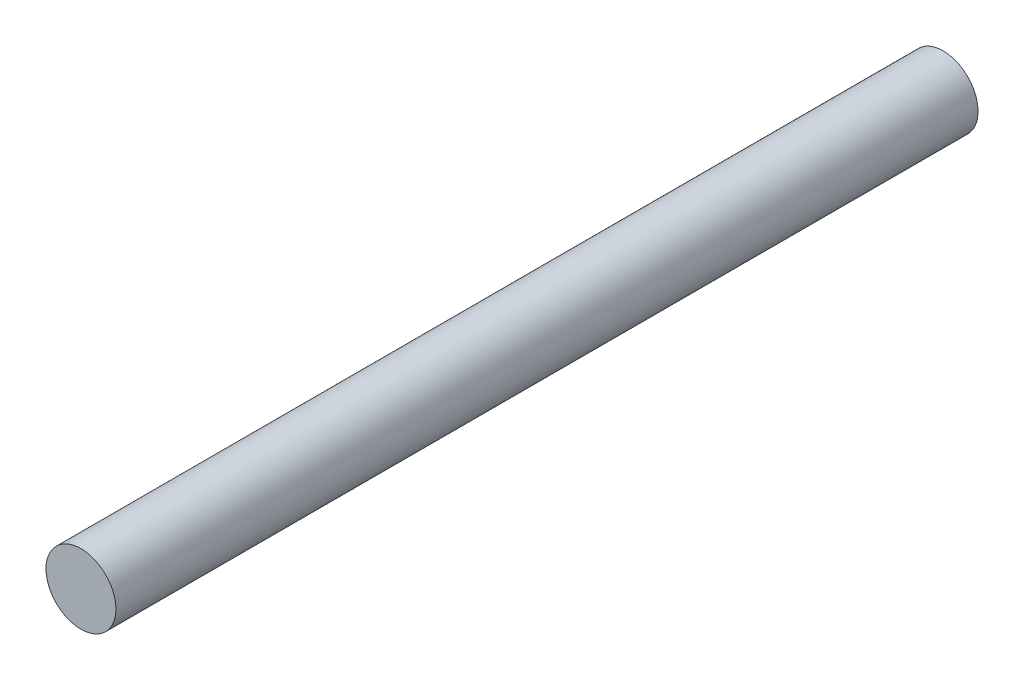
ISO-10303-21;
HEADER;
FILE_DESCRIPTION(('STEP AP214'),'2;1');
FILE_NAME('part.step','',(''),(''),'','','');
FILE_SCHEMA(('AUTOMOTIVE_DESIGN { 1 0 10303 214 1 1 1 1 }'));
ENDSEC;
DATA;
#1=APPLICATION_CONTEXT('core data for automotive mechanical design processes');
#2=APPLICATION_PROTOCOL_DEFINITION('international standard','automotive_design',2000,#1);
#3=PRODUCT_CONTEXT('',#1,'mechanical');
#4=PRODUCT('Part','Part','',(#3));
#5=PRODUCT_RELATED_PRODUCT_CATEGORY('part','',(#4));
#6=PRODUCT_DEFINITION_FORMATION('','',#4);
#7=PRODUCT_DEFINITION_CONTEXT('part definition',#1,'design');
#8=PRODUCT_DEFINITION('design','',#6,#7);
#9=PRODUCT_DEFINITION_SHAPE('','',#8);
#10=(LENGTH_UNIT() NAMED_UNIT(*) SI_UNIT(.MILLI.,.METRE.));
#11=(NAMED_UNIT(*) PLANE_ANGLE_UNIT() SI_UNIT($,.RADIAN.));
#12=(NAMED_UNIT(*) SI_UNIT($,.STERADIAN.) SOLID_ANGLE_UNIT());
#13=UNCERTAINTY_MEASURE_WITH_UNIT(LENGTH_MEASURE(1.E-05),#10,'distance_accuracy_value','');
#14=(GEOMETRIC_REPRESENTATION_CONTEXT(3) GLOBAL_UNCERTAINTY_ASSIGNED_CONTEXT((#13)) GLOBAL_UNIT_ASSIGNED_CONTEXT((#10,
#11,#12)) REPRESENTATION_CONTEXT('',''));
#15=CARTESIAN_POINT('',(0.,0.,0.));
#16=DIRECTION('',(0.,0.,1.));
#17=DIRECTION('',(1.,0.,0.));
#18=AXIS2_PLACEMENT_3D('',#15,#16,#17);
#19=CARTESIAN_POINT('',(0.,0.,1219.2));
#20=DIRECTION('',(0.,0.,-1.));
#21=DIRECTION('',(-1.,0.,0.));
#22=AXIS2_PLACEMENT_3D('',#19,#20,#21);
#23=CYLINDRICAL_SURFACE('',#22,49.403);
#24=CARTESIAN_POINT('',(0.,0.,1219.2));
#25=DIRECTION('',(0.,0.,1.));
#26=DIRECTION('',(1.,0.,0.));
#27=AXIS2_PLACEMENT_3D('',#24,#25,#26);
#28=CIRCLE('',#27,49.403);
#29=CARTESIAN_POINT('',(-49.403,0.,1219.2));
#30=VERTEX_POINT('',#29);
#31=EDGE_CURVE('E10',#30,#30,#28,.T.);
#32=CARTESIAN_POINT('',(0.,0.,0.));
#33=DIRECTION('',(0.,0.,1.));
#34=DIRECTION('',(1.,0.,0.));
#35=AXIS2_PLACEMENT_3D('',#32,#33,#34);
#36=CIRCLE('',#35,49.403);
#37=CARTESIAN_POINT('',(-49.403,0.,0.));
#38=VERTEX_POINT('',#37);
#39=EDGE_CURVE('E34',#38,#38,#36,.T.);
#40=CARTESIAN_POINT('',(-49.403,0.,1219.2));
#41=CARTESIAN_POINT('',(-49.403,0.,1206.5));
#42=CARTESIAN_POINT('',(-49.403,0.,1193.8));
#43=CARTESIAN_POINT('',(-49.403,0.,1168.4));
#44=CARTESIAN_POINT('',(-49.403,0.,1155.7));
#45=CARTESIAN_POINT('',(-49.403,0.,1130.3));
#46=CARTESIAN_POINT('',(-49.403,0.,1117.6));
#47=CARTESIAN_POINT('',(-49.403,0.,1092.2));
#48=CARTESIAN_POINT('',(-49.403,0.,1079.5));
#49=CARTESIAN_POINT('',(-49.403,0.,1054.1));
#50=CARTESIAN_POINT('',(-49.403,0.,1041.4));
#51=CARTESIAN_POINT('',(-49.403,0.,1016.));
#52=CARTESIAN_POINT('',(-49.403,0.,1003.3));
#53=CARTESIAN_POINT('',(-49.403,0.,977.9));
#54=CARTESIAN_POINT('',(-49.403,0.,965.2));
#55=CARTESIAN_POINT('',(-49.403,0.,939.8));
#56=CARTESIAN_POINT('',(-49.403,0.,927.1));
#57=CARTESIAN_POINT('',(-49.403,0.,901.7));
#58=CARTESIAN_POINT('',(-49.403,0.,889.));
#59=CARTESIAN_POINT('',(-49.403,0.,863.6));
#60=CARTESIAN_POINT('',(-49.403,0.,850.9));
#61=CARTESIAN_POINT('',(-49.403,0.,825.5));
#62=CARTESIAN_POINT('',(-49.403,0.,812.8));
#63=CARTESIAN_POINT('',(-49.403,0.,787.4));
#64=CARTESIAN_POINT('',(-49.403,0.,774.7));
#65=CARTESIAN_POINT('',(-49.403,0.,749.3));
#66=CARTESIAN_POINT('',(-49.403,0.,736.6));
#67=CARTESIAN_POINT('',(-49.403,0.,711.2));
#68=CARTESIAN_POINT('',(-49.403,0.,698.5));
#69=CARTESIAN_POINT('',(-49.403,0.,673.1));
#70=CARTESIAN_POINT('',(-49.403,0.,660.4));
#71=CARTESIAN_POINT('',(-49.403,0.,635.));
#72=CARTESIAN_POINT('',(-49.403,0.,622.3));
#73=CARTESIAN_POINT('',(-49.403,0.,596.9));
#74=CARTESIAN_POINT('',(-49.403,0.,584.2));
#75=CARTESIAN_POINT('',(-49.403,0.,558.8));
#76=CARTESIAN_POINT('',(-49.403,0.,546.1));
#77=CARTESIAN_POINT('',(-49.403,0.,520.7));
#78=CARTESIAN_POINT('',(-49.403,0.,508.));
#79=CARTESIAN_POINT('',(-49.403,0.,482.6));
#80=CARTESIAN_POINT('',(-49.403,0.,469.9));
#81=CARTESIAN_POINT('',(-49.403,0.,444.5));
#82=CARTESIAN_POINT('',(-49.403,0.,431.8));
#83=CARTESIAN_POINT('',(-49.403,0.,406.4));
#84=CARTESIAN_POINT('',(-49.403,0.,393.7));
#85=CARTESIAN_POINT('',(-49.403,0.,368.3));
#86=CARTESIAN_POINT('',(-49.403,0.,355.6));
#87=CARTESIAN_POINT('',(-49.403,0.,330.2));
#88=CARTESIAN_POINT('',(-49.403,0.,317.5));
#89=CARTESIAN_POINT('',(-49.403,0.,292.1));
#90=CARTESIAN_POINT('',(-49.403,0.,279.4));
#91=CARTESIAN_POINT('',(-49.403,0.,254.));
#92=CARTESIAN_POINT('',(-49.403,0.,241.3));
#93=CARTESIAN_POINT('',(-49.403,0.,215.9));
#94=CARTESIAN_POINT('',(-49.403,0.,203.2));
#95=CARTESIAN_POINT('',(-49.403,0.,177.8));
#96=CARTESIAN_POINT('',(-49.403,0.,165.1));
#97=CARTESIAN_POINT('',(-49.403,0.,139.7));
#98=CARTESIAN_POINT('',(-49.403,0.,127.));
#99=CARTESIAN_POINT('',(-49.403,0.,101.6));
#100=CARTESIAN_POINT('',(-49.403,0.,88.9));
#101=CARTESIAN_POINT('',(-49.403,0.,63.5));
#102=CARTESIAN_POINT('',(-49.403,0.,50.8));
#103=CARTESIAN_POINT('',(-49.403,0.,25.4));
#104=CARTESIAN_POINT('',(-49.403,0.,12.7));
#105=CARTESIAN_POINT('',(-49.403,0.,0.));
#106=B_SPLINE_CURVE_WITH_KNOTS('',3,(#40,#41,#42,#43,#44,#45,#46,#47,#48,#49,#50,#51,#52,#53,
#54,#55,#56,#57,#58,#59,#60,#61,#62,#63,#64,#65,#66,#67,#68,#69,#70,#71,#72,#73,#74,#75,#76,#77,
#78,#79,#80,#81,#82,#83,#84,#85,#86,#87,#88,#89,#90,#91,#92,#93,#94,#95,#96,#97,#98,#99,#100,
#101,#102,#103,#104,#105),.UNSPECIFIED.,.F.,.F.,(4,2,2,2,2,2,2,2,2,2,2,2,2,2,2,2,2,2,2,2,2,2,2,
2,2,2,2,2,2,2,2,2,4),(0.,38.0999999999998,76.1999999999998,114.3,152.4,190.5,228.6,266.7,304.8,
342.9,381.,419.1,457.2,495.3,533.4,571.5,609.6,647.7,685.8,723.9,762.,800.1,838.2,876.3,914.4,
952.5,990.6,1028.7,1066.8,1104.9,1143.,1181.1,1219.2),.UNSPECIFIED.);
#107=EDGE_CURVE('BSEAM31',#30,#38,#106,.T.);
#108=ORIENTED_EDGE('',*,*,#31,.F.);
#109=ORIENTED_EDGE('',*,*,#39,.T.);
#110=ORIENTED_EDGE('',*,*,#107,.T.);
#111=ORIENTED_EDGE('',*,*,#107,.F.);
#112=EDGE_LOOP('',(#108,#110,#109,#111));
#113=FACE_BOUND('',#112,.T.);
#114=ADVANCED_FACE('F31',(#113),#23,.T.);
#115=CARTESIAN_POINT('',(0.,0.,1219.2));
#116=DIRECTION('',(0.,0.,1.));
#117=DIRECTION('',(1.,0.,0.));
#118=AXIS2_PLACEMENT_3D('',#115,#116,#117);
#119=PLANE('',#118);
#120=ORIENTED_EDGE('',*,*,#31,.T.);
#121=EDGE_LOOP('',(#120));
#122=FACE_BOUND('',#121,.T.);
#123=ADVANCED_FACE('F46',(#122),#119,.T.);
#124=CARTESIAN_POINT('',(0.,0.,0.));
#125=DIRECTION('',(0.,0.,1.));
#126=DIRECTION('',(1.,0.,0.));
#127=AXIS2_PLACEMENT_3D('',#124,#125,#126);
#128=PLANE('',#127);
#129=ORIENTED_EDGE('',*,*,#39,.F.);
#130=EDGE_LOOP('',(#129));
#131=FACE_BOUND('',#130,.T.);
#132=ADVANCED_FACE('F44',(#131),#128,.F.);
#133=CLOSED_SHELL('',(#114,#123,#132));
#134=MANIFOLD_SOLID_BREP('B2',#133);
#135=ADVANCED_BREP_SHAPE_REPRESENTATION('',(#18,#134),#14);
#136=SHAPE_DEFINITION_REPRESENTATION(#9,#135);
ENDSEC;
END-ISO-10303-21;
